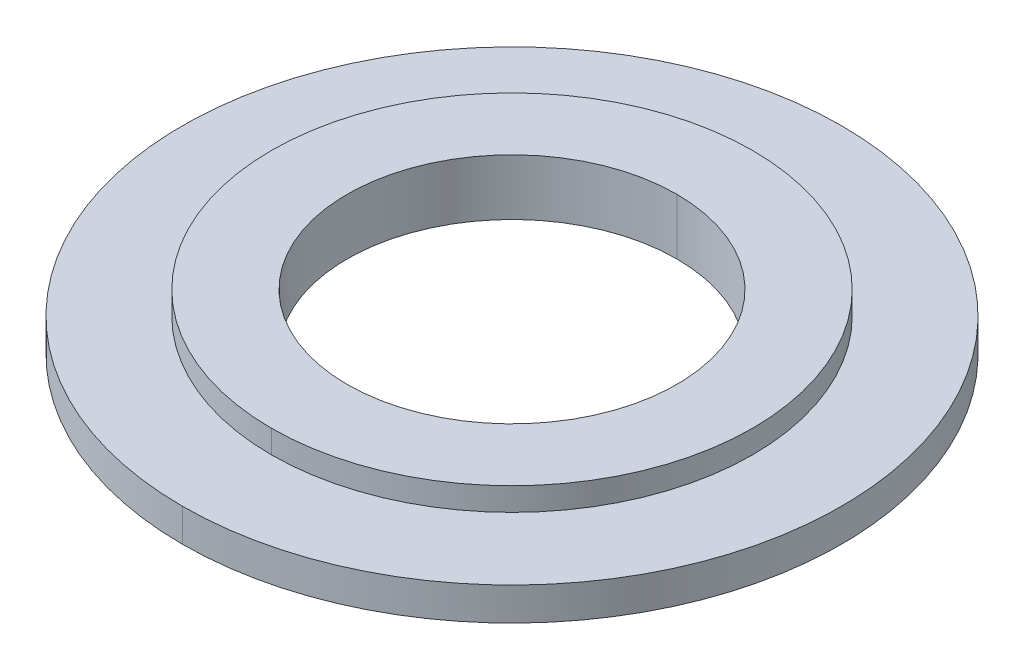
ISO-10303-21;
HEADER;
FILE_DESCRIPTION(('STEP AP214'),'2;1');
FILE_NAME('part.step','',(''),(''),'','','');
FILE_SCHEMA(('AUTOMOTIVE_DESIGN { 1 0 10303 214 1 1 1 1 }'));
ENDSEC;
DATA;
#1=APPLICATION_CONTEXT('core data for automotive mechanical design processes');
#2=APPLICATION_PROTOCOL_DEFINITION('international standard','automotive_design',2000,#1);
#3=PRODUCT_CONTEXT('',#1,'mechanical');
#4=PRODUCT('Part','Part','',(#3));
#5=PRODUCT_RELATED_PRODUCT_CATEGORY('part','',(#4));
#6=PRODUCT_DEFINITION_FORMATION('','',#4);
#7=PRODUCT_DEFINITION_CONTEXT('part definition',#1,'design');
#8=PRODUCT_DEFINITION('design','',#6,#7);
#9=PRODUCT_DEFINITION_SHAPE('','',#8);
#10=(LENGTH_UNIT() NAMED_UNIT(*) SI_UNIT(.MILLI.,.METRE.));
#11=(NAMED_UNIT(*) PLANE_ANGLE_UNIT() SI_UNIT($,.RADIAN.));
#12=(NAMED_UNIT(*) SI_UNIT($,.STERADIAN.) SOLID_ANGLE_UNIT());
#13=UNCERTAINTY_MEASURE_WITH_UNIT(LENGTH_MEASURE(1.E-05),#10,'distance_accuracy_value','');
#14=(GEOMETRIC_REPRESENTATION_CONTEXT(3) GLOBAL_UNCERTAINTY_ASSIGNED_CONTEXT((#13)) GLOBAL_UNIT_ASSIGNED_CONTEXT((#10,
#11,#12)) REPRESENTATION_CONTEXT('',''));
#15=CARTESIAN_POINT('',(0.,0.,0.));
#16=DIRECTION('',(0.,0.,1.));
#17=DIRECTION('',(1.,0.,0.));
#18=AXIS2_PLACEMENT_3D('',#15,#16,#17);
#19=CARTESIAN_POINT('',(0.,0.7,0.));
#20=DIRECTION('',(0.,1.,0.));
#21=DIRECTION('',(1.,0.,0.));
#22=AXIS2_PLACEMENT_3D('',#19,#20,#21);
#23=PLANE('',#22);
#24=CARTESIAN_POINT('',(0.,0.7,0.));
#25=DIRECTION('',(0.,1.,0.));
#26=DIRECTION('',(0.,0.,1.));
#27=AXIS2_PLACEMENT_3D('',#24,#25,#26);
#28=CIRCLE('',#27,5.);
#29=CARTESIAN_POINT('',(0.,0.7,5.));
#30=VERTEX_POINT('',#29);
#31=CARTESIAN_POINT('',(0.,0.7,-5.));
#32=VERTEX_POINT('',#31);
#33=EDGE_CURVE('E62',#30,#32,#28,.T.);
#34=ORIENTED_EDGE('',*,*,#33,.F.);
#35=CARTESIAN_POINT('',(0.,0.7,0.));
#36=DIRECTION('',(0.,1.,0.));
#37=DIRECTION('',(0.,0.,1.));
#38=AXIS2_PLACEMENT_3D('',#35,#36,#37);
#39=CIRCLE('',#38,5.);
#40=EDGE_CURVE('E118',#32,#30,#39,.T.);
#41=ORIENTED_EDGE('',*,*,#40,.F.);
#42=EDGE_LOOP('',(#34,#41));
#43=FACE_BOUND('',#42,.T.);
#44=CARTESIAN_POINT('',(0.,0.7,0.));
#45=DIRECTION('',(0.,1.,0.));
#46=DIRECTION('',(0.,0.,1.));
#47=AXIS2_PLACEMENT_3D('',#44,#45,#46);
#48=CIRCLE('',#47,7.3);
#49=CARTESIAN_POINT('',(0.,0.7,-7.3));
#50=VERTEX_POINT('',#49);
#51=CARTESIAN_POINT('',(0.,0.7,7.3));
#52=VERTEX_POINT('',#51);
#53=EDGE_CURVE('E9',#50,#52,#48,.T.);
#54=ORIENTED_EDGE('',*,*,#53,.T.);
#55=CARTESIAN_POINT('',(0.,0.7,0.));
#56=DIRECTION('',(0.,1.,0.));
#57=DIRECTION('',(0.,0.,1.));
#58=AXIS2_PLACEMENT_3D('',#55,#56,#57);
#59=CIRCLE('',#58,7.3);
#60=EDGE_CURVE('E330',#52,#50,#59,.T.);
#61=ORIENTED_EDGE('',*,*,#60,.T.);
#62=EDGE_LOOP('',(#54,#61));
#63=FACE_BOUND('',#62,.T.);
#64=ADVANCED_FACE('F15',(#43,#63),#23,.T.);
#65=CARTESIAN_POINT('',(0.,0.7,0.));
#66=DIRECTION('',(0.,-1.,0.));
#67=DIRECTION('',(0.,0.,-1.));
#68=AXIS2_PLACEMENT_3D('',#65,#66,#67);
#69=CYLINDRICAL_SURFACE('',#68,7.3);
#70=DIRECTION('',(0.,-1.,0.));
#71=VECTOR('',#70,1.);
#72=CARTESIAN_POINT('',(0.,0.7,7.3));
#73=LINE('',#72,#71);
#74=CARTESIAN_POINT('',(0.,0.,7.3));
#75=VERTEX_POINT('',#74);
#76=EDGE_CURVE('E333',#52,#75,#73,.T.);
#77=ORIENTED_EDGE('',*,*,#76,.F.);
#78=ORIENTED_EDGE('',*,*,#53,.F.);
#79=DIRECTION('',(0.,-1.,0.));
#80=VECTOR('',#79,1.);
#81=CARTESIAN_POINT('',(0.,0.7,-7.3));
#82=LINE('',#81,#80);
#83=CARTESIAN_POINT('',(0.,0.,-7.3));
#84=VERTEX_POINT('',#83);
#85=EDGE_CURVE('E123',#50,#84,#82,.T.);
#86=ORIENTED_EDGE('',*,*,#85,.T.);
#87=CARTESIAN_POINT('',(0.,0.,0.));
#88=DIRECTION('',(0.,1.,0.));
#89=DIRECTION('',(0.,0.,1.));
#90=AXIS2_PLACEMENT_3D('',#87,#88,#89);
#91=CIRCLE('',#90,7.3);
#92=EDGE_CURVE('E18',#84,#75,#91,.T.);
#93=ORIENTED_EDGE('',*,*,#92,.T.);
#94=EDGE_LOOP('',(#77,#78,#86,#93));
#95=FACE_BOUND('',#94,.T.);
#96=ADVANCED_FACE('F171',(#95),#69,.T.);
#97=CARTESIAN_POINT('',(0.,0.,0.));
#98=DIRECTION('',(0.,1.,0.));
#99=DIRECTION('',(1.,0.,0.));
#100=AXIS2_PLACEMENT_3D('',#97,#98,#99);
#101=PLANE('',#100);
#102=ORIENTED_EDGE('',*,*,#92,.F.);
#103=CARTESIAN_POINT('',(0.,0.,0.));
#104=DIRECTION('',(0.,1.,0.));
#105=DIRECTION('',(0.,0.,1.));
#106=AXIS2_PLACEMENT_3D('',#103,#104,#105);
#107=CIRCLE('',#106,7.3);
#108=EDGE_CURVE('E128',#75,#84,#107,.T.);
#109=ORIENTED_EDGE('',*,*,#108,.F.);
#110=EDGE_LOOP('',(#102,#109));
#111=FACE_BOUND('',#110,.T.);
#112=CARTESIAN_POINT('',(0.,0.,0.));
#113=DIRECTION('',(0.,1.,0.));
#114=DIRECTION('',(0.,0.,1.));
#115=AXIS2_PLACEMENT_3D('',#112,#113,#114);
#116=CIRCLE('',#115,10.);
#117=CARTESIAN_POINT('',(0.,0.,10.));
#118=VERTEX_POINT('',#117);
#119=CARTESIAN_POINT('',(0.,0.,-10.));
#120=VERTEX_POINT('',#119);
#121=EDGE_CURVE('E138',#118,#120,#116,.T.);
#122=ORIENTED_EDGE('',*,*,#121,.T.);
#123=CARTESIAN_POINT('',(0.,0.,0.));
#124=DIRECTION('',(0.,1.,0.));
#125=DIRECTION('',(0.,0.,1.));
#126=AXIS2_PLACEMENT_3D('',#123,#124,#125);
#127=CIRCLE('',#126,10.);
#128=EDGE_CURVE('E38',#120,#118,#127,.T.);
#129=ORIENTED_EDGE('',*,*,#128,.T.);
#130=EDGE_LOOP('',(#122,#129));
#131=FACE_BOUND('',#130,.T.);
#132=ADVANCED_FACE('F176',(#111,#131),#101,.T.);
#133=CARTESIAN_POINT('',(0.,-1.,0.));
#134=DIRECTION('',(0.,1.,0.));
#135=DIRECTION('',(1.,0.,0.));
#136=AXIS2_PLACEMENT_3D('',#133,#134,#135);
#137=PLANE('',#136);
#138=CARTESIAN_POINT('',(0.,-1.,0.));
#139=DIRECTION('',(0.,1.,0.));
#140=DIRECTION('',(0.,0.,1.));
#141=AXIS2_PLACEMENT_3D('',#138,#139,#140);
#142=CIRCLE('',#141,5.);
#143=CARTESIAN_POINT('',(0.,-1.,5.));
#144=VERTEX_POINT('',#143);
#145=CARTESIAN_POINT('',(0.,-1.,-5.));
#146=VERTEX_POINT('',#145);
#147=EDGE_CURVE('E102',#144,#146,#142,.T.);
#148=ORIENTED_EDGE('',*,*,#147,.T.);
#149=CARTESIAN_POINT('',(0.,-1.,0.));
#150=DIRECTION('',(0.,1.,0.));
#151=DIRECTION('',(0.,0.,1.));
#152=AXIS2_PLACEMENT_3D('',#149,#150,#151);
#153=CIRCLE('',#152,5.);
#154=EDGE_CURVE('E107',#146,#144,#153,.T.);
#155=ORIENTED_EDGE('',*,*,#154,.T.);
#156=EDGE_LOOP('',(#148,#155));
#157=FACE_BOUND('',#156,.T.);
#158=CARTESIAN_POINT('',(0.,-1.,0.));
#159=DIRECTION('',(0.,1.,0.));
#160=DIRECTION('',(0.,0.,1.));
#161=AXIS2_PLACEMENT_3D('',#158,#159,#160);
#162=CIRCLE('',#161,10.);
#163=CARTESIAN_POINT('',(0.,-1.,10.));
#164=VERTEX_POINT('',#163);
#165=CARTESIAN_POINT('',(0.,-1.,-10.));
#166=VERTEX_POINT('',#165);
#167=EDGE_CURVE('E139',#164,#166,#162,.T.);
#168=ORIENTED_EDGE('',*,*,#167,.F.);
#169=CARTESIAN_POINT('',(0.,-1.,0.));
#170=DIRECTION('',(0.,1.,0.));
#171=DIRECTION('',(0.,0.,1.));
#172=AXIS2_PLACEMENT_3D('',#169,#170,#171);
#173=CIRCLE('',#172,10.);
#174=EDGE_CURVE('E74',#166,#164,#173,.T.);
#175=ORIENTED_EDGE('',*,*,#174,.F.);
#176=EDGE_LOOP('',(#168,#175));
#177=FACE_BOUND('',#176,.T.);
#178=ADVANCED_FACE('F104',(#157,#177),#137,.F.);
#179=CARTESIAN_POINT('',(0.,-1.,0.));
#180=DIRECTION('',(0.,1.,0.));
#181=DIRECTION('',(0.,0.,1.));
#182=AXIS2_PLACEMENT_3D('',#179,#180,#181);
#183=CYLINDRICAL_SURFACE('',#182,5.);
#184=DIRECTION('',(0.,1.,0.));
#185=VECTOR('',#184,1.);
#186=CARTESIAN_POINT('',(0.,-1.,-5.));
#187=LINE('',#186,#185);
#188=EDGE_CURVE('E113',#146,#32,#187,.T.);
#189=ORIENTED_EDGE('',*,*,#188,.F.);
#190=ORIENTED_EDGE('',*,*,#147,.F.);
#191=DIRECTION('',(0.,1.,0.));
#192=VECTOR('',#191,1.);
#193=CARTESIAN_POINT('',(0.,-1.,5.));
#194=LINE('',#193,#192);
#195=EDGE_CURVE('E121',#144,#30,#194,.T.);
#196=ORIENTED_EDGE('',*,*,#195,.T.);
#197=ORIENTED_EDGE('',*,*,#33,.T.);
#198=EDGE_LOOP('',(#189,#190,#196,#197));
#199=FACE_BOUND('',#198,.T.);
#200=ADVANCED_FACE('F114',(#199),#183,.F.);
#201=CARTESIAN_POINT('',(0.,-1.,0.));
#202=DIRECTION('',(0.,1.,0.));
#203=DIRECTION('',(0.,0.,1.));
#204=AXIS2_PLACEMENT_3D('',#201,#202,#203);
#205=CYLINDRICAL_SURFACE('',#204,10.);
#206=DIRECTION('',(0.,1.,0.));
#207=VECTOR('',#206,1.);
#208=CARTESIAN_POINT('',(0.,-1.,-10.));
#209=LINE('',#208,#207);
#210=EDGE_CURVE('E134',#166,#120,#209,.T.);
#211=ORIENTED_EDGE('',*,*,#210,.F.);
#212=ORIENTED_EDGE('',*,*,#174,.T.);
#213=DIRECTION('',(0.,1.,0.));
#214=VECTOR('',#213,1.);
#215=CARTESIAN_POINT('',(0.,-1.,10.));
#216=LINE('',#215,#214);
#217=EDGE_CURVE('E142',#164,#118,#216,.T.);
#218=ORIENTED_EDGE('',*,*,#217,.T.);
#219=ORIENTED_EDGE('',*,*,#128,.F.);
#220=EDGE_LOOP('',(#211,#212,#218,#219));
#221=FACE_BOUND('',#220,.T.);
#222=ADVANCED_FACE('F197',(#221),#205,.T.);
#223=CARTESIAN_POINT('',(0.,-1.,0.));
#224=DIRECTION('',(0.,1.,0.));
#225=DIRECTION('',(0.,0.,1.));
#226=AXIS2_PLACEMENT_3D('',#223,#224,#225);
#227=CYLINDRICAL_SURFACE('',#226,10.);
#228=ORIENTED_EDGE('',*,*,#167,.T.);
#229=ORIENTED_EDGE('',*,*,#210,.T.);
#230=ORIENTED_EDGE('',*,*,#121,.F.);
#231=ORIENTED_EDGE('',*,*,#217,.F.);
#232=EDGE_LOOP('',(#228,#229,#230,#231));
#233=FACE_BOUND('',#232,.T.);
#234=ADVANCED_FACE('F187',(#233),#227,.T.);
#235=CARTESIAN_POINT('',(0.,-1.,0.));
#236=DIRECTION('',(0.,1.,0.));
#237=DIRECTION('',(0.,0.,1.));
#238=AXIS2_PLACEMENT_3D('',#235,#236,#237);
#239=CYLINDRICAL_SURFACE('',#238,5.);
#240=ORIENTED_EDGE('',*,*,#154,.F.);
#241=ORIENTED_EDGE('',*,*,#188,.T.);
#242=ORIENTED_EDGE('',*,*,#40,.T.);
#243=ORIENTED_EDGE('',*,*,#195,.F.);
#244=EDGE_LOOP('',(#240,#241,#242,#243));
#245=FACE_BOUND('',#244,.T.);
#246=ADVANCED_FACE('F120',(#245),#239,.F.);
#247=CARTESIAN_POINT('',(0.,0.7,0.));
#248=DIRECTION('',(0.,-1.,0.));
#249=DIRECTION('',(0.,0.,-1.));
#250=AXIS2_PLACEMENT_3D('',#247,#248,#249);
#251=CYLINDRICAL_SURFACE('',#250,7.3);
#252=ORIENTED_EDGE('',*,*,#60,.F.);
#253=ORIENTED_EDGE('',*,*,#76,.T.);
#254=ORIENTED_EDGE('',*,*,#108,.T.);
#255=ORIENTED_EDGE('',*,*,#85,.F.);
#256=EDGE_LOOP('',(#252,#253,#254,#255));
#257=FACE_BOUND('',#256,.T.);
#258=ADVANCED_FACE('F158',(#257),#251,.T.);
#259=CLOSED_SHELL('',(#64,#96,#132,#178,#200,#222,#234,#246,#258));
#260=MANIFOLD_SOLID_BREP('B1',#259);
#261=ADVANCED_BREP_SHAPE_REPRESENTATION('',(#18,#260),#14);
#262=SHAPE_DEFINITION_REPRESENTATION(#9,#261);
ENDSEC;
END-ISO-10303-21;
